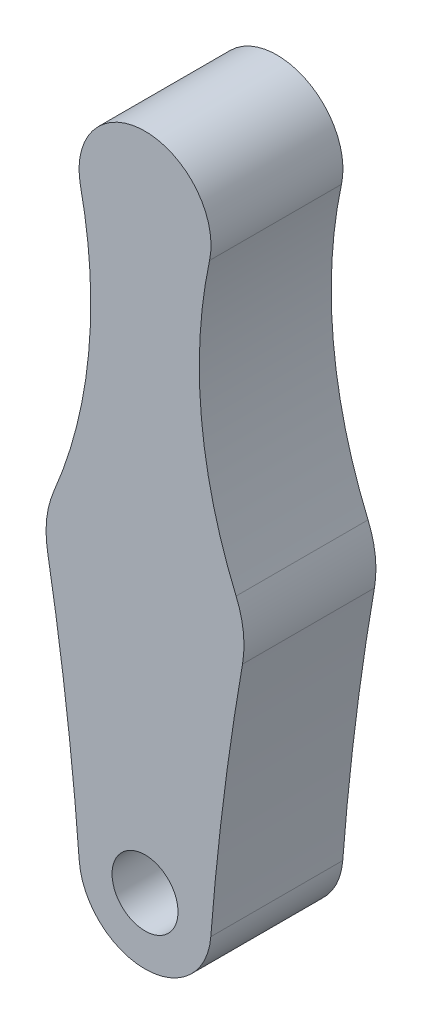
ISO-10303-21;
HEADER;
FILE_DESCRIPTION(('STEP AP214'),'2;1');
FILE_NAME('part.step','',(''),(''),'','','');
FILE_SCHEMA(('AUTOMOTIVE_DESIGN { 1 0 10303 214 1 1 1 1 }'));
ENDSEC;
DATA;
#1=APPLICATION_CONTEXT('core data for automotive mechanical design processes');
#2=APPLICATION_PROTOCOL_DEFINITION('international standard','automotive_design',2000,#1);
#3=PRODUCT_CONTEXT('',#1,'mechanical');
#4=PRODUCT('Part','Part','',(#3));
#5=PRODUCT_RELATED_PRODUCT_CATEGORY('part','',(#4));
#6=PRODUCT_DEFINITION_FORMATION('','',#4);
#7=PRODUCT_DEFINITION_CONTEXT('part definition',#1,'design');
#8=PRODUCT_DEFINITION('design','',#6,#7);
#9=PRODUCT_DEFINITION_SHAPE('','',#8);
#10=(LENGTH_UNIT() NAMED_UNIT(*) SI_UNIT(.MILLI.,.METRE.));
#11=(NAMED_UNIT(*) PLANE_ANGLE_UNIT() SI_UNIT($,.RADIAN.));
#12=(NAMED_UNIT(*) SI_UNIT($,.STERADIAN.) SOLID_ANGLE_UNIT());
#13=UNCERTAINTY_MEASURE_WITH_UNIT(LENGTH_MEASURE(1.E-05),#10,'distance_accuracy_value','');
#14=(GEOMETRIC_REPRESENTATION_CONTEXT(3) GLOBAL_UNCERTAINTY_ASSIGNED_CONTEXT((#13)) GLOBAL_UNIT_ASSIGNED_CONTEXT((#10,
#11,#12)) REPRESENTATION_CONTEXT('',''));
#15=CARTESIAN_POINT('',(0.,0.,0.));
#16=DIRECTION('',(0.,0.,1.));
#17=DIRECTION('',(1.,0.,0.));
#18=AXIS2_PLACEMENT_3D('',#15,#16,#17);
#19=CARTESIAN_POINT('',(39.1134168157168,36.625,5.));
#20=DIRECTION('',(0.,0.,-1.));
#21=DIRECTION('',(-1.,0.,0.));
#22=AXIS2_PLACEMENT_3D('',#19,#20,#21);
#23=CYLINDRICAL_SURFACE('',#22,35.);
#24=CARTESIAN_POINT('',(39.1134168157168,36.625,-5.));
#25=DIRECTION('',(0.,0.,1.));
#26=DIRECTION('',(1.,0.,0.));
#27=AXIS2_PLACEMENT_3D('',#24,#25,#26);
#28=CIRCLE('',#27,35.);
#29=CARTESIAN_POINT('',(4.8891771019646,43.953125,-5.));
#30=VERTEX_POINT('',#29);
#31=CARTESIAN_POINT('',(6.9023676733618,22.9338235294118,-5.));
#32=VERTEX_POINT('',#31);
#33=EDGE_CURVE('E138',#30,#32,#28,.T.);
#34=ORIENTED_EDGE('',*,*,#33,.F.);
#35=DIRECTION('',(0.,0.,-1.));
#36=VECTOR('',#35,1.);
#37=CARTESIAN_POINT('',(4.8891771019646,43.953125,5.));
#38=LINE('',#37,#36);
#39=CARTESIAN_POINT('',(4.8891771019646,43.953125,5.));
#40=VERTEX_POINT('',#39);
#41=EDGE_CURVE('E11',#40,#30,#38,.T.);
#42=ORIENTED_EDGE('',*,*,#41,.F.);
#43=CARTESIAN_POINT('',(39.1134168157168,36.625,5.));
#44=DIRECTION('',(0.,0.,1.));
#45=DIRECTION('',(1.,0.,0.));
#46=AXIS2_PLACEMENT_3D('',#43,#44,#45);
#47=CIRCLE('',#46,35.);
#48=CARTESIAN_POINT('',(6.9023676733618,22.9338235294118,5.));
#49=VERTEX_POINT('',#48);
#50=EDGE_CURVE('E201',#40,#49,#47,.T.);
#51=ORIENTED_EDGE('',*,*,#50,.T.);
#52=DIRECTION('',(0.,0.,-1.));
#53=VECTOR('',#52,1.);
#54=CARTESIAN_POINT('',(6.9023676733618,22.9338235294118,5.));
#55=LINE('',#54,#53);
#56=EDGE_CURVE('E92',#49,#32,#55,.T.);
#57=ORIENTED_EDGE('',*,*,#56,.T.);
#58=EDGE_LOOP('',(#34,#42,#51,#57));
#59=FACE_BOUND('',#58,.T.);
#60=ADVANCED_FACE('F40',(#59),#23,.F.);
#61=CARTESIAN_POINT('',(0.,45.,5.));
#62=DIRECTION('',(0.,0.,-1.));
#63=DIRECTION('',(-1.,0.,0.));
#64=AXIS2_PLACEMENT_3D('',#61,#62,#63);
#65=CYLINDRICAL_SURFACE('',#64,5.);
#66=CARTESIAN_POINT('',(0.,45.,-5.));
#67=DIRECTION('',(0.,0.,1.));
#68=DIRECTION('',(1.,0.,0.));
#69=AXIS2_PLACEMENT_3D('',#66,#67,#68);
#70=CIRCLE('',#69,5.);
#71=CARTESIAN_POINT('',(-4.8891771019646,43.953125,-5.));
#72=VERTEX_POINT('',#71);
#73=EDGE_CURVE('E142',#30,#72,#70,.T.);
#74=ORIENTED_EDGE('',*,*,#73,.T.);
#75=DIRECTION('',(0.,0.,-1.));
#76=VECTOR('',#75,1.);
#77=CARTESIAN_POINT('',(-4.8891771019646,43.953125,5.));
#78=LINE('',#77,#76);
#79=CARTESIAN_POINT('',(-4.8891771019646,43.953125,5.));
#80=VERTEX_POINT('',#79);
#81=EDGE_CURVE('E49',#80,#72,#78,.T.);
#82=ORIENTED_EDGE('',*,*,#81,.F.);
#83=CARTESIAN_POINT('',(0.,45.,5.));
#84=DIRECTION('',(0.,0.,1.));
#85=DIRECTION('',(1.,0.,0.));
#86=AXIS2_PLACEMENT_3D('',#83,#84,#85);
#87=CIRCLE('',#86,5.);
#88=EDGE_CURVE('E196',#40,#80,#87,.T.);
#89=ORIENTED_EDGE('',*,*,#88,.F.);
#90=ORIENTED_EDGE('',*,*,#41,.T.);
#91=EDGE_LOOP('',(#74,#82,#89,#90));
#92=FACE_BOUND('',#91,.T.);
#93=ADVANCED_FACE('F229',(#92),#65,.T.);
#94=CARTESIAN_POINT('',(-39.1134168157168,36.625,5.));
#95=DIRECTION('',(0.,0.,-1.));
#96=DIRECTION('',(-1.,0.,0.));
#97=AXIS2_PLACEMENT_3D('',#94,#95,#96);
#98=CYLINDRICAL_SURFACE('',#97,35.);
#99=CARTESIAN_POINT('',(-39.1134168157168,36.625,-5.));
#100=DIRECTION('',(0.,0.,1.));
#101=DIRECTION('',(1.,0.,0.));
#102=AXIS2_PLACEMENT_3D('',#99,#100,#101);
#103=CIRCLE('',#102,35.);
#104=CARTESIAN_POINT('',(-6.9023676733618,22.9338235294118,-5.));
#105=VERTEX_POINT('',#104);
#106=EDGE_CURVE('E146',#72,#105,#103,.F.);
#107=ORIENTED_EDGE('',*,*,#106,.T.);
#108=DIRECTION('',(0.,0.,-1.));
#109=VECTOR('',#108,1.);
#110=CARTESIAN_POINT('',(-6.9023676733618,22.9338235294118,5.));
#111=LINE('',#110,#109);
#112=CARTESIAN_POINT('',(-6.9023676733618,22.9338235294118,5.));
#113=VERTEX_POINT('',#112);
#114=EDGE_CURVE('E171',#113,#105,#111,.T.);
#115=ORIENTED_EDGE('',*,*,#114,.F.);
#116=CARTESIAN_POINT('',(-39.1134168157168,36.625,5.));
#117=DIRECTION('',(0.,0.,1.));
#118=DIRECTION('',(1.,0.,0.));
#119=AXIS2_PLACEMENT_3D('',#116,#117,#118);
#120=CIRCLE('',#119,35.);
#121=EDGE_CURVE('E182',#80,#113,#120,.F.);
#122=ORIENTED_EDGE('',*,*,#121,.F.);
#123=ORIENTED_EDGE('',*,*,#81,.T.);
#124=EDGE_LOOP('',(#107,#115,#122,#123));
#125=FACE_BOUND('',#124,.T.);
#126=ADVANCED_FACE('F180',(#125),#98,.F.);
#127=CARTESIAN_POINT('',(0.,20.,5.));
#128=DIRECTION('',(0.,0.,-1.));
#129=DIRECTION('',(-1.,0.,0.));
#130=AXIS2_PLACEMENT_3D('',#127,#128,#129);
#131=CYLINDRICAL_SURFACE('',#130,7.5);
#132=CARTESIAN_POINT('',(0.,20.,-5.));
#133=DIRECTION('',(0.,0.,1.));
#134=DIRECTION('',(1.,0.,0.));
#135=AXIS2_PLACEMENT_3D('',#132,#133,#134);
#136=CIRCLE('',#135,7.5);
#137=CARTESIAN_POINT('',(-7.38765049150101,18.7067018072289,-5.));
#138=VERTEX_POINT('',#137);
#139=EDGE_CURVE('E149',#105,#138,#136,.T.);
#140=ORIENTED_EDGE('',*,*,#139,.T.);
#141=DIRECTION('',(0.,0.,-1.));
#142=VECTOR('',#141,1.);
#143=CARTESIAN_POINT('',(-7.38765049150101,18.7067018072289,5.));
#144=LINE('',#143,#142);
#145=CARTESIAN_POINT('',(-7.38765049150101,18.7067018072289,5.));
#146=VERTEX_POINT('',#145);
#147=EDGE_CURVE('E168',#146,#138,#144,.T.);
#148=ORIENTED_EDGE('',*,*,#147,.F.);
#149=CARTESIAN_POINT('',(0.,20.,5.));
#150=DIRECTION('',(0.,0.,1.));
#151=DIRECTION('',(1.,0.,0.));
#152=AXIS2_PLACEMENT_3D('',#149,#150,#151);
#153=CIRCLE('',#152,7.5);
#154=EDGE_CURVE('E135',#113,#146,#153,.T.);
#155=ORIENTED_EDGE('',*,*,#154,.F.);
#156=ORIENTED_EDGE('',*,*,#114,.T.);
#157=EDGE_LOOP('',(#140,#148,#155,#156));
#158=FACE_BOUND('',#157,.T.);
#159=ADVANCED_FACE('F191',(#158),#131,.T.);
#160=CARTESIAN_POINT('',(-204.391663598194,-15.7812499999999,5.));
#161=DIRECTION('',(0.,0.,-1.));
#162=DIRECTION('',(-1.,0.,0.));
#163=AXIS2_PLACEMENT_3D('',#160,#161,#162);
#164=CYLINDRICAL_SURFACE('',#163,200.);
#165=CARTESIAN_POINT('',(-204.391663598194,-15.7812499999999,-5.));
#166=DIRECTION('',(0.,0.,1.));
#167=DIRECTION('',(1.,0.,0.));
#168=AXIS2_PLACEMENT_3D('',#165,#166,#167);
#169=CIRCLE('',#168,200.);
#170=CARTESIAN_POINT('',(-4.98516252678523,-0.384908536585364,-5.));
#171=VERTEX_POINT('',#170);
#172=EDGE_CURVE('E153',#171,#138,#169,.T.);
#173=ORIENTED_EDGE('',*,*,#172,.F.);
#174=DIRECTION('',(0.,0.,-1.));
#175=VECTOR('',#174,1.);
#176=CARTESIAN_POINT('',(-4.98516252678523,-0.384908536585364,5.));
#177=LINE('',#176,#175);
#178=CARTESIAN_POINT('',(-4.98516252678523,-0.384908536585364,5.));
#179=VERTEX_POINT('',#178);
#180=EDGE_CURVE('E127',#179,#171,#177,.T.);
#181=ORIENTED_EDGE('',*,*,#180,.F.);
#182=CARTESIAN_POINT('',(-204.391663598194,-15.7812499999999,5.));
#183=DIRECTION('',(0.,0.,1.));
#184=DIRECTION('',(1.,0.,0.));
#185=AXIS2_PLACEMENT_3D('',#182,#183,#184);
#186=CIRCLE('',#185,200.);
#187=EDGE_CURVE('E118',#179,#146,#186,.T.);
#188=ORIENTED_EDGE('',*,*,#187,.T.);
#189=ORIENTED_EDGE('',*,*,#147,.T.);
#190=EDGE_LOOP('',(#173,#181,#188,#189));
#191=FACE_BOUND('',#190,.T.);
#192=ADVANCED_FACE('F243',(#191),#164,.F.);
#193=CARTESIAN_POINT('',(0.,0.,5.));
#194=DIRECTION('',(0.,0.,-1.));
#195=DIRECTION('',(-1.,0.,0.));
#196=AXIS2_PLACEMENT_3D('',#193,#194,#195);
#197=CYLINDRICAL_SURFACE('',#196,5.);
#198=CARTESIAN_POINT('',(0.,0.,-5.));
#199=DIRECTION('',(0.,0.,1.));
#200=DIRECTION('',(1.,0.,0.));
#201=AXIS2_PLACEMENT_3D('',#198,#199,#200);
#202=CIRCLE('',#201,5.);
#203=CARTESIAN_POINT('',(4.98516252678523,-0.384908536585364,-5.));
#204=VERTEX_POINT('',#203);
#205=EDGE_CURVE('E125',#171,#204,#202,.T.);
#206=ORIENTED_EDGE('',*,*,#205,.T.);
#207=DIRECTION('',(0.,0.,-1.));
#208=VECTOR('',#207,1.);
#209=CARTESIAN_POINT('',(4.98516252678523,-0.384908536585364,5.));
#210=LINE('',#209,#208);
#211=CARTESIAN_POINT('',(4.98516252678523,-0.384908536585364,5.));
#212=VERTEX_POINT('',#211);
#213=EDGE_CURVE('E122',#212,#204,#210,.T.);
#214=ORIENTED_EDGE('',*,*,#213,.F.);
#215=CARTESIAN_POINT('',(0.,0.,5.));
#216=DIRECTION('',(0.,0.,1.));
#217=DIRECTION('',(1.,0.,0.));
#218=AXIS2_PLACEMENT_3D('',#215,#216,#217);
#219=CIRCLE('',#218,5.);
#220=EDGE_CURVE('E112',#179,#212,#219,.T.);
#221=ORIENTED_EDGE('',*,*,#220,.F.);
#222=ORIENTED_EDGE('',*,*,#180,.T.);
#223=EDGE_LOOP('',(#206,#214,#221,#222));
#224=FACE_BOUND('',#223,.T.);
#225=ADVANCED_FACE('F123',(#224),#197,.T.);
#226=CARTESIAN_POINT('',(204.391663598194,-15.7812499999999,5.));
#227=DIRECTION('',(0.,0.,-1.));
#228=DIRECTION('',(-1.,0.,0.));
#229=AXIS2_PLACEMENT_3D('',#226,#227,#228);
#230=CYLINDRICAL_SURFACE('',#229,200.);
#231=CARTESIAN_POINT('',(204.391663598194,-15.7812499999999,-5.));
#232=DIRECTION('',(0.,0.,1.));
#233=DIRECTION('',(1.,0.,0.));
#234=AXIS2_PLACEMENT_3D('',#231,#232,#233);
#235=CIRCLE('',#234,200.);
#236=CARTESIAN_POINT('',(7.38765049150101,18.7067018072289,-5.));
#237=VERTEX_POINT('',#236);
#238=EDGE_CURVE('E85',#204,#237,#235,.F.);
#239=ORIENTED_EDGE('',*,*,#238,.T.);
#240=DIRECTION('',(0.,0.,-1.));
#241=VECTOR('',#240,1.);
#242=CARTESIAN_POINT('',(7.38765049150101,18.7067018072289,5.));
#243=LINE('',#242,#241);
#244=CARTESIAN_POINT('',(7.38765049150101,18.7067018072289,5.));
#245=VERTEX_POINT('',#244);
#246=EDGE_CURVE('E128',#245,#237,#243,.T.);
#247=ORIENTED_EDGE('',*,*,#246,.F.);
#248=CARTESIAN_POINT('',(204.391663598194,-15.7812499999999,5.));
#249=DIRECTION('',(0.,0.,1.));
#250=DIRECTION('',(1.,0.,0.));
#251=AXIS2_PLACEMENT_3D('',#248,#249,#250);
#252=CIRCLE('',#251,200.);
#253=EDGE_CURVE('E116',#212,#245,#252,.F.);
#254=ORIENTED_EDGE('',*,*,#253,.F.);
#255=ORIENTED_EDGE('',*,*,#213,.T.);
#256=EDGE_LOOP('',(#239,#247,#254,#255));
#257=FACE_BOUND('',#256,.T.);
#258=ADVANCED_FACE('F130',(#257),#230,.F.);
#259=EDGE_CURVE('E154',#237,#32,#136,.T.);
#260=ORIENTED_EDGE('',*,*,#259,.T.);
#261=ORIENTED_EDGE('',*,*,#56,.F.);
#262=EDGE_CURVE('E57',#245,#49,#153,.T.);
#263=ORIENTED_EDGE('',*,*,#262,.F.);
#264=ORIENTED_EDGE('',*,*,#246,.T.);
#265=EDGE_LOOP('',(#260,#261,#263,#264));
#266=FACE_BOUND('',#265,.T.);
#267=ADVANCED_FACE('F225',(#266),#131,.T.);
#268=CARTESIAN_POINT('',(0.,0.,5.));
#269=DIRECTION('',(0.,0.,1.));
#270=DIRECTION('',(1.,0.,0.));
#271=AXIS2_PLACEMENT_3D('',#268,#269,#270);
#272=PLANE('',#271);
#273=CARTESIAN_POINT('',(0.,0.,5.));
#274=DIRECTION('',(0.,0.,-1.));
#275=DIRECTION('',(-1.,0.,0.));
#276=AXIS2_PLACEMENT_3D('',#273,#274,#275);
#277=CIRCLE('',#276,2.5);
#278=CARTESIAN_POINT('',(-2.5,0.,5.));
#279=VERTEX_POINT('',#278);
#280=EDGE_CURVE('E143',#279,#279,#277,.T.);
#281=ORIENTED_EDGE('',*,*,#280,.T.);
#282=EDGE_LOOP('',(#281));
#283=FACE_BOUND('',#282,.T.);
#284=ORIENTED_EDGE('',*,*,#50,.F.);
#285=ORIENTED_EDGE('',*,*,#88,.T.);
#286=ORIENTED_EDGE('',*,*,#121,.T.);
#287=ORIENTED_EDGE('',*,*,#154,.T.);
#288=ORIENTED_EDGE('',*,*,#187,.F.);
#289=ORIENTED_EDGE('',*,*,#220,.T.);
#290=ORIENTED_EDGE('',*,*,#253,.T.);
#291=ORIENTED_EDGE('',*,*,#262,.T.);
#292=EDGE_LOOP('',(#284,#285,#286,#287,#288,#289,#290,#291));
#293=FACE_BOUND('',#292,.T.);
#294=ADVANCED_FACE('F114',(#283,#293),#272,.T.);
#295=CARTESIAN_POINT('',(0.,0.,-5.));
#296=DIRECTION('',(0.,0.,1.));
#297=DIRECTION('',(1.,0.,0.));
#298=AXIS2_PLACEMENT_3D('',#295,#296,#297);
#299=PLANE('',#298);
#300=CARTESIAN_POINT('',(0.,0.,-5.));
#301=DIRECTION('',(0.,0.,-1.));
#302=DIRECTION('',(-1.,0.,0.));
#303=AXIS2_PLACEMENT_3D('',#300,#301,#302);
#304=CIRCLE('',#303,2.5);
#305=CARTESIAN_POINT('',(-2.5,0.,-5.));
#306=VERTEX_POINT('',#305);
#307=EDGE_CURVE('E204',#306,#306,#304,.T.);
#308=ORIENTED_EDGE('',*,*,#307,.F.);
#309=EDGE_LOOP('',(#308));
#310=FACE_BOUND('',#309,.T.);
#311=ORIENTED_EDGE('',*,*,#33,.T.);
#312=ORIENTED_EDGE('',*,*,#259,.F.);
#313=ORIENTED_EDGE('',*,*,#238,.F.);
#314=ORIENTED_EDGE('',*,*,#205,.F.);
#315=ORIENTED_EDGE('',*,*,#172,.T.);
#316=ORIENTED_EDGE('',*,*,#139,.F.);
#317=ORIENTED_EDGE('',*,*,#106,.F.);
#318=ORIENTED_EDGE('',*,*,#73,.F.);
#319=EDGE_LOOP('',(#311,#312,#313,#314,#315,#316,#317,#318));
#320=FACE_BOUND('',#319,.T.);
#321=ADVANCED_FACE('F187',(#310,#320),#299,.F.);
#322=CARTESIAN_POINT('',(0.,0.,5.));
#323=DIRECTION('',(0.,0.,-1.));
#324=DIRECTION('',(-1.,0.,0.));
#325=AXIS2_PLACEMENT_3D('',#322,#323,#324);
#326=CYLINDRICAL_SURFACE('',#325,2.5);
#327=ORIENTED_EDGE('',*,*,#280,.F.);
#328=EDGE_LOOP('',(#327));
#329=FACE_BOUND('',#328,.T.);
#330=ORIENTED_EDGE('',*,*,#307,.T.);
#331=EDGE_LOOP('',(#330));
#332=FACE_BOUND('',#331,.T.);
#333=ADVANCED_FACE('F213',(#329,#332),#326,.F.);
#334=CLOSED_SHELL('',(#60,#93,#126,#159,#192,#225,#258,#267,#294,#321,#333));
#335=MANIFOLD_SOLID_BREP('B2',#334);
#336=ADVANCED_BREP_SHAPE_REPRESENTATION('',(#18,#335),#14);
#337=SHAPE_DEFINITION_REPRESENTATION(#9,#336);
ENDSEC;
END-ISO-10303-21;
